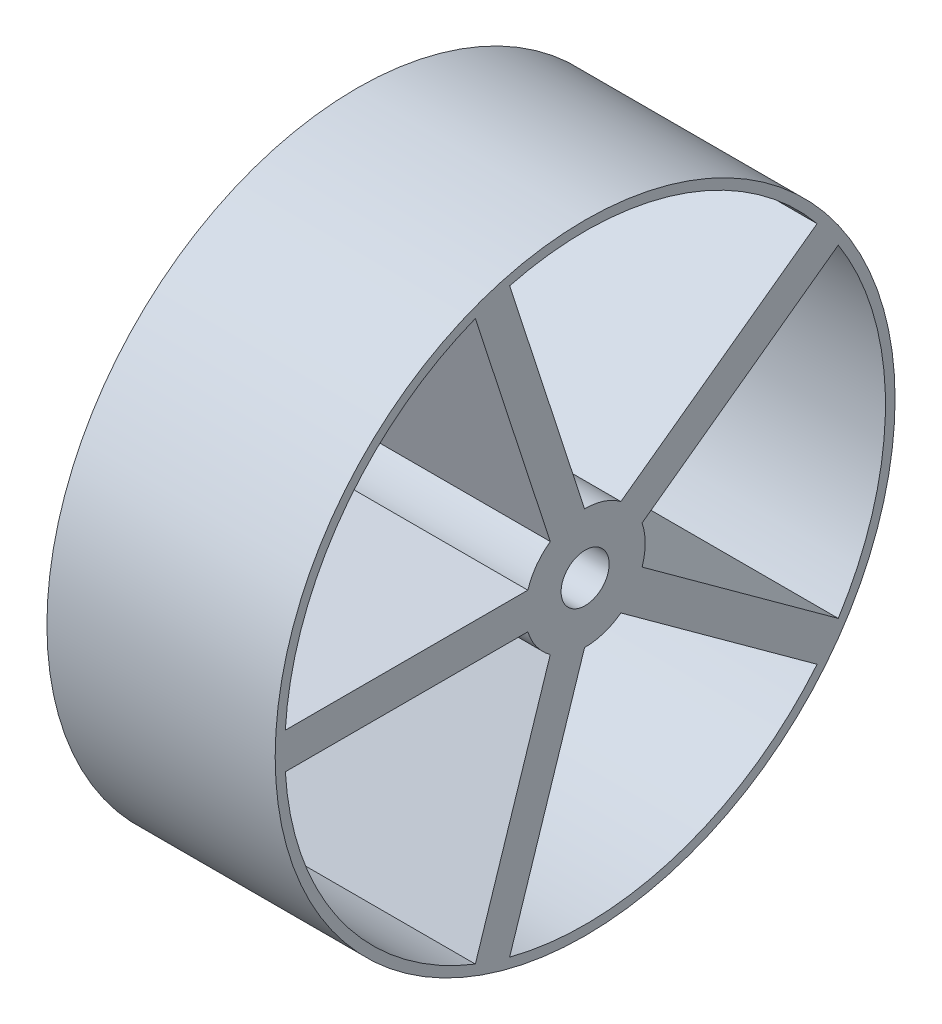
ISO-10303-21;
HEADER;
FILE_DESCRIPTION(('STEP AP214'),'2;1');
FILE_NAME('part.step','',(''),(''),'','','');
FILE_SCHEMA(('AUTOMOTIVE_DESIGN { 1 0 10303 214 1 1 1 1 }'));
ENDSEC;
DATA;
#1=APPLICATION_CONTEXT('core data for automotive mechanical design processes');
#2=APPLICATION_PROTOCOL_DEFINITION('international standard','automotive_design',2000,#1);
#3=PRODUCT_CONTEXT('',#1,'mechanical');
#4=PRODUCT('Part','Part','',(#3));
#5=PRODUCT_RELATED_PRODUCT_CATEGORY('part','',(#4));
#6=PRODUCT_DEFINITION_FORMATION('','',#4);
#7=PRODUCT_DEFINITION_CONTEXT('part definition',#1,'design');
#8=PRODUCT_DEFINITION('design','',#6,#7);
#9=PRODUCT_DEFINITION_SHAPE('','',#8);
#10=(LENGTH_UNIT() NAMED_UNIT(*) SI_UNIT(.MILLI.,.METRE.));
#11=(NAMED_UNIT(*) PLANE_ANGLE_UNIT() SI_UNIT($,.RADIAN.));
#12=(NAMED_UNIT(*) SI_UNIT($,.STERADIAN.) SOLID_ANGLE_UNIT());
#13=UNCERTAINTY_MEASURE_WITH_UNIT(LENGTH_MEASURE(1.E-05),#10,'distance_accuracy_value','');
#14=(GEOMETRIC_REPRESENTATION_CONTEXT(3) GLOBAL_UNCERTAINTY_ASSIGNED_CONTEXT((#13)) GLOBAL_UNIT_ASSIGNED_CONTEXT((#10,
#11,#12)) REPRESENTATION_CONTEXT('',''));
#15=CARTESIAN_POINT('',(0.,0.,0.));
#16=DIRECTION('',(0.,0.,1.));
#17=DIRECTION('',(1.,0.,0.));
#18=AXIS2_PLACEMENT_3D('',#15,#16,#17);
#19=CARTESIAN_POINT('',(47.5,0.,0.));
#20=DIRECTION('',(-1.,0.,0.));
#21=DIRECTION('',(0.,0.,1.));
#22=AXIS2_PLACEMENT_3D('',#19,#20,#21);
#23=CYLINDRICAL_SURFACE('',#22,25.);
#24=CARTESIAN_POINT('',(-47.5,0.,0.));
#25=DIRECTION('',(1.,0.,0.));
#26=DIRECTION('',(0.,0.,-1.));
#27=AXIS2_PLACEMENT_3D('',#24,#25,#26);
#28=CIRCLE('',#27,25.);
#29=CARTESIAN_POINT('',(-47.5,-24.9988797992366,0.236661748743184));
#30=VERTEX_POINT('',#29);
#31=CARTESIAN_POINT('',(-47.5,-20.0854123122249,-14.8854362464768));
#32=VERTEX_POINT('',#31);
#33=EDGE_CURVE('E241',#30,#32,#28,.T.);
#34=ORIENTED_EDGE('',*,*,#33,.T.);
#35=DIRECTION('',(-1.,0.,0.));
#36=VECTOR('',#35,1.);
#37=CARTESIAN_POINT('',(47.5,-20.0854123122249,-14.8854362464768));
#38=LINE('',#37,#36);
#39=CARTESIAN_POINT('',(47.5,-20.0854123122249,-14.8854362464768));
#40=VERTEX_POINT('',#39);
#41=EDGE_CURVE('E11',#40,#32,#38,.T.);
#42=ORIENTED_EDGE('',*,*,#41,.F.);
#43=CARTESIAN_POINT('',(47.5,0.,0.));
#44=DIRECTION('',(1.,0.,0.));
#45=DIRECTION('',(0.,0.,-1.));
#46=AXIS2_PLACEMENT_3D('',#43,#44,#45);
#47=CIRCLE('',#46,25.);
#48=CARTESIAN_POINT('',(47.5,-24.9988797992366,0.236661748743184));
#49=VERTEX_POINT('',#48);
#50=EDGE_CURVE('E204',#49,#40,#47,.T.);
#51=ORIENTED_EDGE('',*,*,#50,.F.);
#52=DIRECTION('',(-1.,0.,0.));
#53=VECTOR('',#52,1.);
#54=CARTESIAN_POINT('',(47.5,-24.9988797992366,0.236661748743184));
#55=LINE('',#54,#53);
#56=EDGE_CURVE('E71',#49,#30,#55,.T.);
#57=ORIENTED_EDGE('',*,*,#56,.T.);
#58=EDGE_LOOP('',(#34,#42,#51,#57));
#59=FACE_BOUND('',#58,.T.);
#60=ADVANCED_FACE('F51',(#59),#23,.T.);
#61=CARTESIAN_POINT('',(47.5,-6.06762745781136,4.40838939219295));
#62=DIRECTION('',(0.,0.809016994374951,-0.587785252292468));
#63=DIRECTION('',(0.,0.587785252292468,0.809016994374951));
#64=AXIS2_PLACEMENT_3D('',#61,#62,#63);
#65=PLANE('',#64);
#66=DIRECTION('',(0.,-0.587785252292468,-0.809016994374951));
#67=VECTOR('',#66,1.);
#68=CARTESIAN_POINT('',(-47.5,-6.06762745781136,4.40838939219295));
#69=LINE('',#68,#67);
#70=CARTESIAN_POINT('',(-47.5,-79.4084130713593,-96.5365419594483));
#71=VERTEX_POINT('',#70);
#72=EDGE_CURVE('E211',#32,#71,#69,.T.);
#73=ORIENTED_EDGE('',*,*,#72,.T.);
#74=DIRECTION('',(-1.,0.,0.));
#75=VECTOR('',#74,1.);
#76=CARTESIAN_POINT('',(47.5,-79.4084130713593,-96.5365419594483));
#77=LINE('',#76,#75);
#78=CARTESIAN_POINT('',(47.5,-79.4084130713593,-96.5365419594483));
#79=VERTEX_POINT('',#78);
#80=EDGE_CURVE('E62',#79,#71,#77,.T.);
#81=ORIENTED_EDGE('',*,*,#80,.F.);
#82=DIRECTION('',(0.,-0.587785252292468,-0.809016994374951));
#83=VECTOR('',#82,1.);
#84=CARTESIAN_POINT('',(47.5,-6.06762745781136,4.40838939219295));
#85=LINE('',#84,#83);
#86=EDGE_CURVE('E197',#40,#79,#85,.T.);
#87=ORIENTED_EDGE('',*,*,#86,.F.);
#88=ORIENTED_EDGE('',*,*,#41,.T.);
#89=EDGE_LOOP('',(#73,#81,#87,#88));
#90=FACE_BOUND('',#89,.T.);
#91=ADVANCED_FACE('F210',(#90),#65,.F.);
#92=CARTESIAN_POINT('',(47.5,0.,0.));
#93=DIRECTION('',(-1.,0.,0.));
#94=DIRECTION('',(0.,0.,1.));
#95=AXIS2_PLACEMENT_3D('',#92,#93,#94);
#96=CYLINDRICAL_SURFACE('',#95,125.);
#97=CARTESIAN_POINT('',(-47.5,0.,0.));
#98=DIRECTION('',(1.,0.,0.));
#99=DIRECTION('',(0.,0.,-1.));
#100=AXIS2_PLACEMENT_3D('',#97,#98,#99);
#101=CIRCLE('',#100,125.);
#102=CARTESIAN_POINT('',(-47.5,-120.985511342153,31.4246089120876));
#103=VERTEX_POINT('',#102);
#104=EDGE_CURVE('E290',#103,#71,#101,.T.);
#105=ORIENTED_EDGE('',*,*,#104,.F.);
#106=DIRECTION('',(-1.,0.,0.));
#107=VECTOR('',#106,1.);
#108=CARTESIAN_POINT('',(47.5,-120.985511342153,31.4246089120876));
#109=LINE('',#108,#107);
#110=CARTESIAN_POINT('',(47.5,-120.985511342153,31.4246089120876));
#111=VERTEX_POINT('',#110);
#112=EDGE_CURVE('E133',#111,#103,#109,.T.);
#113=ORIENTED_EDGE('',*,*,#112,.F.);
#114=CARTESIAN_POINT('',(47.5,0.,0.));
#115=DIRECTION('',(1.,0.,0.));
#116=DIRECTION('',(0.,0.,-1.));
#117=AXIS2_PLACEMENT_3D('',#114,#115,#116);
#118=CIRCLE('',#117,125.);
#119=EDGE_CURVE('E203',#111,#79,#118,.T.);
#120=ORIENTED_EDGE('',*,*,#119,.T.);
#121=ORIENTED_EDGE('',*,*,#80,.T.);
#122=EDGE_LOOP('',(#105,#113,#120,#121));
#123=FACE_BOUND('',#122,.T.);
#124=ADVANCED_FACE('F216',(#123),#96,.F.);
#125=CARTESIAN_POINT('',(47.5,6.06762745781291,-4.40838939219407));
#126=DIRECTION('',(0.,0.809016994374951,-0.587785252292468));
#127=DIRECTION('',(0.,0.587785252292468,0.809016994374951));
#128=AXIS2_PLACEMENT_3D('',#125,#126,#127);
#129=PLANE('',#128);
#130=DIRECTION('',(0.,-0.587785252292468,-0.809016994374951));
#131=VECTOR('',#130,1.);
#132=CARTESIAN_POINT('',(-47.5,6.06762745781291,-4.40838939219407));
#133=LINE('',#132,#131);
#134=CARTESIAN_POINT('',(-47.5,-7.95015739660028,-23.7022150308633));
#135=VERTEX_POINT('',#134);
#136=CARTESIAN_POINT('',(-47.5,-67.2731581557352,-105.353320743835));
#137=VERTEX_POINT('',#136);
#138=EDGE_CURVE('E275',#135,#137,#133,.T.);
#139=ORIENTED_EDGE('',*,*,#138,.F.);
#140=DIRECTION('',(-1.,0.,0.));
#141=VECTOR('',#140,1.);
#142=CARTESIAN_POINT('',(47.5,-7.95015739660028,-23.7022150308633));
#143=LINE('',#142,#141);
#144=CARTESIAN_POINT('',(47.5,-7.95015739660028,-23.7022150308633));
#145=VERTEX_POINT('',#144);
#146=EDGE_CURVE('E308',#145,#135,#143,.T.);
#147=ORIENTED_EDGE('',*,*,#146,.F.);
#148=DIRECTION('',(0.,-0.587785252292468,-0.809016994374951));
#149=VECTOR('',#148,1.);
#150=CARTESIAN_POINT('',(47.5,6.06762745781291,-4.40838939219407));
#151=LINE('',#150,#149);
#152=CARTESIAN_POINT('',(47.5,-67.2731581557352,-105.353320743835));
#153=VERTEX_POINT('',#152);
#154=EDGE_CURVE('E753',#145,#153,#151,.T.);
#155=ORIENTED_EDGE('',*,*,#154,.T.);
#156=DIRECTION('',(-1.,0.,0.));
#157=VECTOR('',#156,1.);
#158=CARTESIAN_POINT('',(47.5,-67.2731581557352,-105.353320743835));
#159=LINE('',#158,#157);
#160=EDGE_CURVE('E311',#153,#137,#159,.T.);
#161=ORIENTED_EDGE('',*,*,#160,.T.);
#162=EDGE_LOOP('',(#139,#147,#155,#161));
#163=FACE_BOUND('',#162,.T.);
#164=ADVANCED_FACE('F398',(#163),#129,.T.);
#165=CARTESIAN_POINT('',(-47.5,7.95015739660207,-23.7022150308627));
#166=VERTEX_POINT('',#165);
#167=EDGE_CURVE('E279',#135,#166,#28,.T.);
#168=ORIENTED_EDGE('',*,*,#167,.T.);
#169=DIRECTION('',(-1.,0.,0.));
#170=VECTOR('',#169,1.);
#171=CARTESIAN_POINT('',(47.5,7.95015739660207,-23.7022150308627));
#172=LINE('',#171,#170);
#173=CARTESIAN_POINT('',(47.5,7.95015739660207,-23.7022150308627));
#174=VERTEX_POINT('',#173);
#175=EDGE_CURVE('E318',#174,#166,#172,.T.);
#176=ORIENTED_EDGE('',*,*,#175,.F.);
#177=EDGE_CURVE('E758',#145,#174,#47,.T.);
#178=ORIENTED_EDGE('',*,*,#177,.F.);
#179=ORIENTED_EDGE('',*,*,#146,.T.);
#180=EDGE_LOOP('',(#168,#176,#178,#179));
#181=FACE_BOUND('',#180,.T.);
#182=ADVANCED_FACE('F390',(#181),#23,.T.);
#183=CARTESIAN_POINT('',(47.5,-6.06762745781152,-4.40838939219311));
#184=DIRECTION('',(0.,0.809016994374948,0.587785252292472));
#185=DIRECTION('',(0.,-0.587785252292472,0.809016994374948));
#186=AXIS2_PLACEMENT_3D('',#183,#184,#185);
#187=PLANE('',#186);
#188=DIRECTION('',(0.,0.587785252292472,-0.809016994374949));
#189=VECTOR('',#188,1.);
#190=CARTESIAN_POINT('',(-47.5,-6.06762745781152,-4.40838939219311));
#191=LINE('',#190,#189);
#192=CARTESIAN_POINT('',(-47.5,67.2731581557372,-105.353320743834));
#193=VERTEX_POINT('',#192);
#194=EDGE_CURVE('E280',#166,#193,#191,.T.);
#195=ORIENTED_EDGE('',*,*,#194,.T.);
#196=DIRECTION('',(-1.,0.,0.));
#197=VECTOR('',#196,1.);
#198=CARTESIAN_POINT('',(47.5,67.2731581557372,-105.353320743834));
#199=LINE('',#198,#197);
#200=CARTESIAN_POINT('',(47.5,67.2731581557372,-105.353320743834));
#201=VERTEX_POINT('',#200);
#202=EDGE_CURVE('E314',#201,#193,#199,.T.);
#203=ORIENTED_EDGE('',*,*,#202,.F.);
#204=DIRECTION('',(0.,0.587785252292472,-0.809016994374949));
#205=VECTOR('',#204,1.);
#206=CARTESIAN_POINT('',(47.5,-6.06762745781152,-4.40838939219311));
#207=LINE('',#206,#205);
#208=EDGE_CURVE('E762',#174,#201,#207,.T.);
#209=ORIENTED_EDGE('',*,*,#208,.F.);
#210=ORIENTED_EDGE('',*,*,#175,.T.);
#211=EDGE_LOOP('',(#195,#203,#209,#210));
#212=FACE_BOUND('',#211,.T.);
#213=ADVANCED_FACE('F397',(#212),#187,.F.);
#214=CARTESIAN_POINT('',(47.5,6.06762745781271,4.40838939219397));
#215=DIRECTION('',(0.,0.809016994374948,0.587785252292472));
#216=DIRECTION('',(0.,-0.587785252292472,0.809016994374948));
#217=AXIS2_PLACEMENT_3D('',#214,#215,#216);
#218=PLANE('',#217);
#219=DIRECTION('',(0.,0.587785252292472,-0.809016994374949));
#220=VECTOR('',#219,1.);
#221=CARTESIAN_POINT('',(-47.5,6.06762745781271,4.40838939219397));
#222=LINE('',#221,#220);
#223=CARTESIAN_POINT('',(-47.5,20.085412312226,-14.8854362464752));
#224=VERTEX_POINT('',#223);
#225=CARTESIAN_POINT('',(-47.5,79.4084130713616,-96.5365419594474));
#226=VERTEX_POINT('',#225);
#227=EDGE_CURVE('E262',#224,#226,#222,.T.);
#228=ORIENTED_EDGE('',*,*,#227,.F.);
#229=DIRECTION('',(-1.,0.,0.));
#230=VECTOR('',#229,1.);
#231=CARTESIAN_POINT('',(47.5,20.085412312226,-14.8854362464752));
#232=LINE('',#231,#230);
#233=CARTESIAN_POINT('',(47.5,20.085412312226,-14.8854362464752));
#234=VERTEX_POINT('',#233);
#235=EDGE_CURVE('E315',#234,#224,#232,.T.);
#236=ORIENTED_EDGE('',*,*,#235,.F.);
#237=DIRECTION('',(0.,0.587785252292472,-0.809016994374949));
#238=VECTOR('',#237,1.);
#239=CARTESIAN_POINT('',(47.5,6.06762745781271,4.40838939219397));
#240=LINE('',#239,#238);
#241=CARTESIAN_POINT('',(47.5,79.4084130713616,-96.5365419594474));
#242=VERTEX_POINT('',#241);
#243=EDGE_CURVE('E741',#234,#242,#240,.T.);
#244=ORIENTED_EDGE('',*,*,#243,.T.);
#245=DIRECTION('',(-1.,0.,0.));
#246=VECTOR('',#245,1.);
#247=CARTESIAN_POINT('',(47.5,79.4084130713616,-96.5365419594474));
#248=LINE('',#247,#246);
#249=EDGE_CURVE('E324',#242,#226,#248,.T.);
#250=ORIENTED_EDGE('',*,*,#249,.T.);
#251=EDGE_LOOP('',(#228,#236,#244,#250));
#252=FACE_BOUND('',#251,.T.);
#253=ADVANCED_FACE('F404',(#252),#218,.T.);
#254=CARTESIAN_POINT('',(-47.5,24.9988797992366,0.236661748743887));
#255=VERTEX_POINT('',#254);
#256=EDGE_CURVE('E266',#224,#255,#28,.T.);
#257=ORIENTED_EDGE('',*,*,#256,.T.);
#258=DIRECTION('',(-1.,0.,0.));
#259=VECTOR('',#258,1.);
#260=CARTESIAN_POINT('',(47.5,24.9988797992366,0.236661748743887));
#261=LINE('',#260,#259);
#262=CARTESIAN_POINT('',(47.5,24.9988797992366,0.236661748743887));
#263=VERTEX_POINT('',#262);
#264=EDGE_CURVE('E331',#263,#255,#261,.T.);
#265=ORIENTED_EDGE('',*,*,#264,.F.);
#266=EDGE_CURVE('E746',#234,#263,#47,.T.);
#267=ORIENTED_EDGE('',*,*,#266,.F.);
#268=ORIENTED_EDGE('',*,*,#235,.T.);
#269=EDGE_LOOP('',(#257,#265,#267,#268));
#270=FACE_BOUND('',#269,.T.);
#271=ADVANCED_FACE('F400',(#270),#23,.T.);
#272=CARTESIAN_POINT('',(47.5,2.31762745781204,-7.13292387221357));
#273=DIRECTION('',(0.,-0.309016994374943,0.951056516295155));
#274=DIRECTION('',(0.,-0.951056516295155,-0.309016994374943));
#275=AXIS2_PLACEMENT_3D('',#272,#273,#274);
#276=PLANE('',#275);
#277=DIRECTION('',(0.,0.951056516295155,0.309016994374943));
#278=VECTOR('',#277,1.);
#279=CARTESIAN_POINT('',(-47.5,2.31762745781204,-7.13292387221357));
#280=LINE('',#279,#278);
#281=CARTESIAN_POINT('',(-47.5,120.985511342154,31.424608912088));
#282=VERTEX_POINT('',#281);
#283=EDGE_CURVE('E267',#255,#282,#280,.T.);
#284=ORIENTED_EDGE('',*,*,#283,.T.);
#285=DIRECTION('',(-1.,0.,0.));
#286=VECTOR('',#285,1.);
#287=CARTESIAN_POINT('',(47.5,120.985511342154,31.424608912088));
#288=LINE('',#287,#286);
#289=CARTESIAN_POINT('',(47.5,120.985511342154,31.424608912088));
#290=VERTEX_POINT('',#289);
#291=EDGE_CURVE('E327',#290,#282,#288,.T.);
#292=ORIENTED_EDGE('',*,*,#291,.F.);
#293=DIRECTION('',(0.,0.951056516295155,0.309016994374943));
#294=VECTOR('',#293,1.);
#295=CARTESIAN_POINT('',(47.5,2.31762745781204,-7.13292387221357));
#296=LINE('',#295,#294);
#297=EDGE_CURVE('E751',#263,#290,#296,.T.);
#298=ORIENTED_EDGE('',*,*,#297,.F.);
#299=ORIENTED_EDGE('',*,*,#264,.T.);
#300=EDGE_LOOP('',(#284,#292,#298,#299));
#301=FACE_BOUND('',#300,.T.);
#302=ADVANCED_FACE('F411',(#301),#276,.F.);
#303=CARTESIAN_POINT('',(47.5,-2.31762745781211,7.13292387221376));
#304=DIRECTION('',(0.,-0.309016994374943,0.951056516295155));
#305=DIRECTION('',(0.,-0.951056516295155,-0.309016994374943));
#306=AXIS2_PLACEMENT_3D('',#303,#304,#305);
#307=PLANE('',#306);
#308=DIRECTION('',(0.,0.951056516295155,0.309016994374943));
#309=VECTOR('',#308,1.);
#310=CARTESIAN_POINT('',(-47.5,-2.31762745781211,7.13292387221376));
#311=LINE('',#310,#309);
#312=CARTESIAN_POINT('',(-47.5,20.3636248836124,14.5025094931712));
#313=VERTEX_POINT('',#312);
#314=CARTESIAN_POINT('',(-47.5,116.350256426529,45.6904566565152));
#315=VERTEX_POINT('',#314);
#316=EDGE_CURVE('E250',#313,#315,#311,.T.);
#317=ORIENTED_EDGE('',*,*,#316,.F.);
#318=DIRECTION('',(-1.,0.,0.));
#319=VECTOR('',#318,1.);
#320=CARTESIAN_POINT('',(47.5,20.3636248836124,14.5025094931712));
#321=LINE('',#320,#319);
#322=CARTESIAN_POINT('',(47.5,20.3636248836124,14.5025094931712));
#323=VERTEX_POINT('',#322);
#324=EDGE_CURVE('E328',#323,#313,#321,.T.);
#325=ORIENTED_EDGE('',*,*,#324,.F.);
#326=DIRECTION('',(0.,0.951056516295155,0.309016994374943));
#327=VECTOR('',#326,1.);
#328=CARTESIAN_POINT('',(47.5,-2.31762745781211,7.13292387221376));
#329=LINE('',#328,#327);
#330=CARTESIAN_POINT('',(47.5,116.350256426529,45.6904566565152));
#331=VERTEX_POINT('',#330);
#332=EDGE_CURVE('E782',#323,#331,#329,.T.);
#333=ORIENTED_EDGE('',*,*,#332,.T.);
#334=DIRECTION('',(-1.,0.,0.));
#335=VECTOR('',#334,1.);
#336=CARTESIAN_POINT('',(47.5,116.350256426529,45.6904566565152));
#337=LINE('',#336,#335);
#338=EDGE_CURVE('E337',#331,#315,#337,.T.);
#339=ORIENTED_EDGE('',*,*,#338,.T.);
#340=EDGE_LOOP('',(#317,#325,#333,#339));
#341=FACE_BOUND('',#340,.T.);
#342=ADVANCED_FACE('F416',(#341),#307,.T.);
#343=CARTESIAN_POINT('',(-47.5,7.5,23.8484800354236));
#344=VERTEX_POINT('',#343);
#345=EDGE_CURVE('E242',#313,#344,#28,.T.);
#346=ORIENTED_EDGE('',*,*,#345,.T.);
#347=DIRECTION('',(-1.,0.,0.));
#348=VECTOR('',#347,1.);
#349=CARTESIAN_POINT('',(47.5,7.5,23.8484800354236));
#350=LINE('',#349,#348);
#351=CARTESIAN_POINT('',(47.5,7.5,23.8484800354236));
#352=VERTEX_POINT('',#351);
#353=EDGE_CURVE('E343',#352,#344,#350,.T.);
#354=ORIENTED_EDGE('',*,*,#353,.F.);
#355=EDGE_CURVE('E776',#323,#352,#47,.T.);
#356=ORIENTED_EDGE('',*,*,#355,.F.);
#357=ORIENTED_EDGE('',*,*,#324,.T.);
#358=EDGE_LOOP('',(#346,#354,#356,#357));
#359=FACE_BOUND('',#358,.T.);
#360=ADVANCED_FACE('F387',(#359),#23,.T.);
#361=CARTESIAN_POINT('',(47.5,7.5,0.));
#362=DIRECTION('',(0.,-1.,0.));
#363=DIRECTION('',(0.,0.,-1.));
#364=AXIS2_PLACEMENT_3D('',#361,#362,#363);
#365=PLANE('',#364);
#366=DIRECTION('',(0.,0.,1.));
#367=VECTOR('',#366,1.);
#368=CARTESIAN_POINT('',(-47.5,7.5,0.));
#369=LINE('',#368,#367);
#370=CARTESIAN_POINT('',(-47.5,7.5,124.774797134678));
#371=VERTEX_POINT('',#370);
#372=EDGE_CURVE('E254',#344,#371,#369,.T.);
#373=ORIENTED_EDGE('',*,*,#372,.T.);
#374=DIRECTION('',(-1.,0.,0.));
#375=VECTOR('',#374,1.);
#376=CARTESIAN_POINT('',(47.5,7.5,124.774797134678));
#377=LINE('',#376,#375);
#378=CARTESIAN_POINT('',(47.5,7.5,124.774797134678));
#379=VERTEX_POINT('',#378);
#380=EDGE_CURVE('E340',#379,#371,#377,.T.);
#381=ORIENTED_EDGE('',*,*,#380,.F.);
#382=DIRECTION('',(0.,0.,1.));
#383=VECTOR('',#382,1.);
#384=CARTESIAN_POINT('',(47.5,7.5,0.));
#385=LINE('',#384,#383);
#386=EDGE_CURVE('E781',#352,#379,#385,.T.);
#387=ORIENTED_EDGE('',*,*,#386,.F.);
#388=ORIENTED_EDGE('',*,*,#353,.T.);
#389=EDGE_LOOP('',(#373,#381,#387,#388));
#390=FACE_BOUND('',#389,.T.);
#391=ADVANCED_FACE('F423',(#390),#365,.F.);
#392=CARTESIAN_POINT('',(47.5,-7.5,0.));
#393=DIRECTION('',(0.,-1.,0.));
#394=DIRECTION('',(0.,0.,-1.));
#395=AXIS2_PLACEMENT_3D('',#392,#393,#394);
#396=PLANE('',#395);
#397=DIRECTION('',(0.,0.,1.));
#398=VECTOR('',#397,1.);
#399=CARTESIAN_POINT('',(-47.5,-7.5,0.));
#400=LINE('',#399,#398);
#401=CARTESIAN_POINT('',(-47.5,-7.5,23.8484800354236));
#402=VERTEX_POINT('',#401);
#403=CARTESIAN_POINT('',(-47.5,-7.5,124.774797134678));
#404=VERTEX_POINT('',#403);
#405=EDGE_CURVE('E233',#402,#404,#400,.T.);
#406=ORIENTED_EDGE('',*,*,#405,.F.);
#407=DIRECTION('',(-1.,0.,0.));
#408=VECTOR('',#407,1.);
#409=CARTESIAN_POINT('',(47.5,-7.5,23.8484800354236));
#410=LINE('',#409,#408);
#411=CARTESIAN_POINT('',(47.5,-7.5,23.8484800354236));
#412=VERTEX_POINT('',#411);
#413=EDGE_CURVE('E55',#412,#402,#410,.T.);
#414=ORIENTED_EDGE('',*,*,#413,.F.);
#415=DIRECTION('',(0.,0.,1.));
#416=VECTOR('',#415,1.);
#417=CARTESIAN_POINT('',(47.5,-7.5,0.));
#418=LINE('',#417,#416);
#419=CARTESIAN_POINT('',(47.5,-7.5,124.774797134678));
#420=VERTEX_POINT('',#419);
#421=EDGE_CURVE('E305',#412,#420,#418,.T.);
#422=ORIENTED_EDGE('',*,*,#421,.T.);
#423=DIRECTION('',(-1.,0.,0.));
#424=VECTOR('',#423,1.);
#425=CARTESIAN_POINT('',(47.5,-7.5,124.774797134678));
#426=LINE('',#425,#424);
#427=EDGE_CURVE('E232',#420,#404,#426,.T.);
#428=ORIENTED_EDGE('',*,*,#427,.T.);
#429=EDGE_LOOP('',(#406,#414,#422,#428));
#430=FACE_BOUND('',#429,.T.);
#431=ADVANCED_FACE('F53',(#430),#396,.T.);
#432=CARTESIAN_POINT('',(-47.5,-20.3636248836128,14.5025094931706));
#433=VERTEX_POINT('',#432);
#434=EDGE_CURVE('E237',#402,#433,#28,.T.);
#435=ORIENTED_EDGE('',*,*,#434,.T.);
#436=DIRECTION('',(-1.,0.,0.));
#437=VECTOR('',#436,1.);
#438=CARTESIAN_POINT('',(47.5,-20.3636248836128,14.5025094931706));
#439=LINE('',#438,#437);
#440=CARTESIAN_POINT('',(47.5,-20.3636248836128,14.5025094931706));
#441=VERTEX_POINT('',#440);
#442=EDGE_CURVE('E353',#441,#433,#439,.T.);
#443=ORIENTED_EDGE('',*,*,#442,.F.);
#444=EDGE_CURVE('E364',#412,#441,#47,.T.);
#445=ORIENTED_EDGE('',*,*,#444,.F.);
#446=ORIENTED_EDGE('',*,*,#413,.T.);
#447=EDGE_LOOP('',(#435,#443,#445,#446));
#448=FACE_BOUND('',#447,.T.);
#449=ADVANCED_FACE('F363',(#448),#23,.T.);
#450=CARTESIAN_POINT('',(47.5,2.3176274578119,7.13292387221301));
#451=DIRECTION('',(0.,-0.309016994374947,-0.951056516295154));
#452=DIRECTION('',(0.,0.951056516295154,-0.309016994374947));
#453=AXIS2_PLACEMENT_3D('',#450,#451,#452);
#454=PLANE('',#453);
#455=DIRECTION('',(0.,-0.951056516295154,0.309016994374947));
#456=VECTOR('',#455,1.);
#457=CARTESIAN_POINT('',(-47.5,2.3176274578119,7.13292387221301));
#458=LINE('',#457,#456);
#459=CARTESIAN_POINT('',(-47.5,-116.350256426529,45.6904566565149));
#460=VERTEX_POINT('',#459);
#461=EDGE_CURVE('E240',#433,#460,#458,.T.);
#462=ORIENTED_EDGE('',*,*,#461,.T.);
#463=DIRECTION('',(-1.,0.,0.));
#464=VECTOR('',#463,1.);
#465=CARTESIAN_POINT('',(47.5,-116.350256426529,45.6904566565149));
#466=LINE('',#465,#464);
#467=CARTESIAN_POINT('',(47.5,-116.350256426529,45.6904566565149));
#468=VERTEX_POINT('',#467);
#469=EDGE_CURVE('E351',#468,#460,#466,.T.);
#470=ORIENTED_EDGE('',*,*,#469,.F.);
#471=DIRECTION('',(0.,-0.951056516295154,0.309016994374947));
#472=VECTOR('',#471,1.);
#473=CARTESIAN_POINT('',(47.5,2.3176274578119,7.13292387221301));
#474=LINE('',#473,#472);
#475=EDGE_CURVE('E775',#441,#468,#474,.T.);
#476=ORIENTED_EDGE('',*,*,#475,.F.);
#477=ORIENTED_EDGE('',*,*,#442,.T.);
#478=EDGE_LOOP('',(#462,#470,#476,#477));
#479=FACE_BOUND('',#478,.T.);
#480=ADVANCED_FACE('F376',(#479),#454,.F.);
#481=CARTESIAN_POINT('',(47.5,0.,0.));
#482=DIRECTION('',(-1.,0.,0.));
#483=DIRECTION('',(0.,0.,1.));
#484=AXIS2_PLACEMENT_3D('',#481,#482,#483);
#485=CYLINDRICAL_SURFACE('',#484,129.);
#486=CARTESIAN_POINT('',(47.5,0.,0.));
#487=DIRECTION('',(1.,0.,0.));
#488=DIRECTION('',(0.,0.,-1.));
#489=AXIS2_PLACEMENT_3D('',#486,#487,#488);
#490=CIRCLE('',#489,129.);
#491=CARTESIAN_POINT('',(47.5,0.,-129.));
#492=VERTEX_POINT('',#491);
#493=EDGE_CURVE('E221',#492,#492,#490,.T.);
#494=ORIENTED_EDGE('',*,*,#493,.F.);
#495=EDGE_LOOP('',(#494));
#496=FACE_BOUND('',#495,.T.);
#497=CARTESIAN_POINT('',(-47.5,0.,0.));
#498=DIRECTION('',(1.,0.,0.));
#499=DIRECTION('',(0.,0.,-1.));
#500=AXIS2_PLACEMENT_3D('',#497,#498,#499);
#501=CIRCLE('',#500,129.);
#502=CARTESIAN_POINT('',(-47.5,0.,-129.));
#503=VERTEX_POINT('',#502);
#504=EDGE_CURVE('E297',#503,#503,#501,.T.);
#505=ORIENTED_EDGE('',*,*,#504,.T.);
#506=EDGE_LOOP('',(#505));
#507=FACE_BOUND('',#506,.T.);
#508=ADVANCED_FACE('F378',(#496,#507),#485,.T.);
#509=CARTESIAN_POINT('',(47.5,-2.31762745781232,-7.13292387221431));
#510=DIRECTION('',(0.,-0.309016994374948,-0.951056516295153));
#511=DIRECTION('',(0.,0.951056516295154,-0.309016994374948));
#512=AXIS2_PLACEMENT_3D('',#509,#510,#511);
#513=PLANE('',#512);
#514=DIRECTION('',(0.,-0.951056516295154,0.309016994374948));
#515=VECTOR('',#514,1.);
#516=CARTESIAN_POINT('',(-47.5,-2.31762745781232,-7.13292387221431));
#517=LINE('',#516,#515);
#518=EDGE_CURVE('E293',#30,#103,#517,.T.);
#519=ORIENTED_EDGE('',*,*,#518,.F.);
#520=ORIENTED_EDGE('',*,*,#56,.F.);
#521=DIRECTION('',(0.,-0.951056516295154,0.309016994374948));
#522=VECTOR('',#521,1.);
#523=CARTESIAN_POINT('',(47.5,-2.31762745781232,-7.13292387221431));
#524=LINE('',#523,#522);
#525=EDGE_CURVE('E218',#49,#111,#524,.T.);
#526=ORIENTED_EDGE('',*,*,#525,.T.);
#527=ORIENTED_EDGE('',*,*,#112,.T.);
#528=EDGE_LOOP('',(#519,#520,#526,#527));
#529=FACE_BOUND('',#528,.T.);
#530=ADVANCED_FACE('F383',(#529),#513,.T.);
#531=CARTESIAN_POINT('',(47.5,0.,0.));
#532=DIRECTION('',(-1.,0.,0.));
#533=DIRECTION('',(0.,0.,1.));
#534=AXIS2_PLACEMENT_3D('',#531,#532,#533);
#535=CYLINDRICAL_SURFACE('',#534,125.);
#536=CARTESIAN_POINT('',(-47.5,0.,0.));
#537=DIRECTION('',(1.,0.,0.));
#538=DIRECTION('',(0.,0.,-1.));
#539=AXIS2_PLACEMENT_3D('',#536,#537,#538);
#540=CIRCLE('',#539,125.);
#541=EDGE_CURVE('E284',#137,#193,#540,.T.);
#542=ORIENTED_EDGE('',*,*,#541,.F.);
#543=ORIENTED_EDGE('',*,*,#160,.F.);
#544=CARTESIAN_POINT('',(47.5,0.,0.));
#545=DIRECTION('',(1.,0.,0.));
#546=DIRECTION('',(0.,0.,-1.));
#547=AXIS2_PLACEMENT_3D('',#544,#545,#546);
#548=CIRCLE('',#547,125.);
#549=EDGE_CURVE('E764',#153,#201,#548,.T.);
#550=ORIENTED_EDGE('',*,*,#549,.T.);
#551=ORIENTED_EDGE('',*,*,#202,.T.);
#552=EDGE_LOOP('',(#542,#543,#550,#551));
#553=FACE_BOUND('',#552,.T.);
#554=ADVANCED_FACE('F448',(#553),#535,.F.);
#555=CARTESIAN_POINT('',(47.5,0.,0.));
#556=DIRECTION('',(-1.,0.,0.));
#557=DIRECTION('',(0.,0.,1.));
#558=AXIS2_PLACEMENT_3D('',#555,#556,#557);
#559=CYLINDRICAL_SURFACE('',#558,125.);
#560=CARTESIAN_POINT('',(-47.5,0.,0.));
#561=DIRECTION('',(1.,0.,0.));
#562=DIRECTION('',(0.,0.,-1.));
#563=AXIS2_PLACEMENT_3D('',#560,#561,#562);
#564=CIRCLE('',#563,125.);
#565=EDGE_CURVE('E271',#226,#282,#564,.T.);
#566=ORIENTED_EDGE('',*,*,#565,.F.);
#567=ORIENTED_EDGE('',*,*,#249,.F.);
#568=CARTESIAN_POINT('',(47.5,0.,0.));
#569=DIRECTION('',(1.,0.,0.));
#570=DIRECTION('',(0.,0.,-1.));
#571=AXIS2_PLACEMENT_3D('',#568,#569,#570);
#572=CIRCLE('',#571,125.);
#573=EDGE_CURVE('E749',#242,#290,#572,.T.);
#574=ORIENTED_EDGE('',*,*,#573,.T.);
#575=ORIENTED_EDGE('',*,*,#291,.T.);
#576=EDGE_LOOP('',(#566,#567,#574,#575));
#577=FACE_BOUND('',#576,.T.);
#578=ADVANCED_FACE('F453',(#577),#559,.F.);
#579=CARTESIAN_POINT('',(47.5,0.,0.));
#580=DIRECTION('',(-1.,0.,0.));
#581=DIRECTION('',(0.,0.,1.));
#582=AXIS2_PLACEMENT_3D('',#579,#580,#581);
#583=CYLINDRICAL_SURFACE('',#582,125.);
#584=CARTESIAN_POINT('',(-47.5,0.,0.));
#585=DIRECTION('',(1.,0.,0.));
#586=DIRECTION('',(0.,0.,-1.));
#587=AXIS2_PLACEMENT_3D('',#584,#585,#586);
#588=CIRCLE('',#587,125.);
#589=EDGE_CURVE('E258',#315,#371,#588,.T.);
#590=ORIENTED_EDGE('',*,*,#589,.F.);
#591=ORIENTED_EDGE('',*,*,#338,.F.);
#592=CARTESIAN_POINT('',(47.5,0.,0.));
#593=DIRECTION('',(1.,0.,0.));
#594=DIRECTION('',(0.,0.,-1.));
#595=AXIS2_PLACEMENT_3D('',#592,#593,#594);
#596=CIRCLE('',#595,125.);
#597=EDGE_CURVE('E747',#331,#379,#596,.T.);
#598=ORIENTED_EDGE('',*,*,#597,.T.);
#599=ORIENTED_EDGE('',*,*,#380,.T.);
#600=EDGE_LOOP('',(#590,#591,#598,#599));
#601=FACE_BOUND('',#600,.T.);
#602=ADVANCED_FACE('F509',(#601),#583,.F.);
#603=CARTESIAN_POINT('',(47.5,0.,0.));
#604=DIRECTION('',(-1.,0.,0.));
#605=DIRECTION('',(0.,0.,1.));
#606=AXIS2_PLACEMENT_3D('',#603,#604,#605);
#607=CYLINDRICAL_SURFACE('',#606,125.);
#608=CARTESIAN_POINT('',(-47.5,0.,0.));
#609=DIRECTION('',(1.,0.,0.));
#610=DIRECTION('',(0.,0.,-1.));
#611=AXIS2_PLACEMENT_3D('',#608,#609,#610);
#612=CIRCLE('',#611,125.);
#613=EDGE_CURVE('E246',#404,#460,#612,.T.);
#614=ORIENTED_EDGE('',*,*,#613,.F.);
#615=ORIENTED_EDGE('',*,*,#427,.F.);
#616=CARTESIAN_POINT('',(47.5,0.,0.));
#617=DIRECTION('',(1.,0.,0.));
#618=DIRECTION('',(0.,0.,-1.));
#619=AXIS2_PLACEMENT_3D('',#616,#617,#618);
#620=CIRCLE('',#619,125.);
#621=EDGE_CURVE('E374',#420,#468,#620,.T.);
#622=ORIENTED_EDGE('',*,*,#621,.T.);
#623=ORIENTED_EDGE('',*,*,#469,.T.);
#624=EDGE_LOOP('',(#614,#615,#622,#623));
#625=FACE_BOUND('',#624,.T.);
#626=ADVANCED_FACE('F373',(#625),#607,.F.);
#627=CARTESIAN_POINT('',(47.5,0.,0.));
#628=DIRECTION('',(-1.,0.,0.));
#629=DIRECTION('',(0.,0.,1.));
#630=AXIS2_PLACEMENT_3D('',#627,#628,#629);
#631=CYLINDRICAL_SURFACE('',#630,10.);
#632=CARTESIAN_POINT('',(47.5,0.,0.));
#633=DIRECTION('',(1.,0.,0.));
#634=DIRECTION('',(0.,0.,-1.));
#635=AXIS2_PLACEMENT_3D('',#632,#633,#634);
#636=CIRCLE('',#635,10.);
#637=CARTESIAN_POINT('',(47.5,0.,-10.));
#638=VERTEX_POINT('',#637);
#639=EDGE_CURVE('E228',#638,#638,#636,.T.);
#640=ORIENTED_EDGE('',*,*,#639,.T.);
#641=EDGE_LOOP('',(#640));
#642=FACE_BOUND('',#641,.T.);
#643=CARTESIAN_POINT('',(-47.5,0.,0.));
#644=DIRECTION('',(1.,0.,0.));
#645=DIRECTION('',(0.,0.,-1.));
#646=AXIS2_PLACEMENT_3D('',#643,#644,#645);
#647=CIRCLE('',#646,10.);
#648=CARTESIAN_POINT('',(-47.5,0.,-10.));
#649=VERTEX_POINT('',#648);
#650=EDGE_CURVE('E301',#649,#649,#647,.T.);
#651=ORIENTED_EDGE('',*,*,#650,.F.);
#652=EDGE_LOOP('',(#651));
#653=FACE_BOUND('',#652,.T.);
#654=ADVANCED_FACE('F486',(#642,#653),#631,.F.);
#655=CARTESIAN_POINT('',(47.5,0.,0.));
#656=DIRECTION('',(1.,0.,0.));
#657=DIRECTION('',(0.,0.,-1.));
#658=AXIS2_PLACEMENT_3D('',#655,#656,#657);
#659=PLANE('',#658);
#660=ORIENTED_EDGE('',*,*,#421,.F.);
#661=ORIENTED_EDGE('',*,*,#444,.T.);
#662=ORIENTED_EDGE('',*,*,#475,.T.);
#663=ORIENTED_EDGE('',*,*,#621,.F.);
#664=EDGE_LOOP('',(#660,#661,#662,#663));
#665=FACE_BOUND('',#664,.T.);
#666=ORIENTED_EDGE('',*,*,#332,.F.);
#667=ORIENTED_EDGE('',*,*,#355,.T.);
#668=ORIENTED_EDGE('',*,*,#386,.T.);
#669=ORIENTED_EDGE('',*,*,#597,.F.);
#670=EDGE_LOOP('',(#666,#667,#668,#669));
#671=FACE_BOUND('',#670,.T.);
#672=ORIENTED_EDGE('',*,*,#243,.F.);
#673=ORIENTED_EDGE('',*,*,#266,.T.);
#674=ORIENTED_EDGE('',*,*,#297,.T.);
#675=ORIENTED_EDGE('',*,*,#573,.F.);
#676=EDGE_LOOP('',(#672,#673,#674,#675));
#677=FACE_BOUND('',#676,.T.);
#678=ORIENTED_EDGE('',*,*,#154,.F.);
#679=ORIENTED_EDGE('',*,*,#177,.T.);
#680=ORIENTED_EDGE('',*,*,#208,.T.);
#681=ORIENTED_EDGE('',*,*,#549,.F.);
#682=EDGE_LOOP('',(#678,#679,#680,#681));
#683=FACE_BOUND('',#682,.T.);
#684=ORIENTED_EDGE('',*,*,#50,.T.);
#685=ORIENTED_EDGE('',*,*,#86,.T.);
#686=ORIENTED_EDGE('',*,*,#119,.F.);
#687=ORIENTED_EDGE('',*,*,#525,.F.);
#688=EDGE_LOOP('',(#684,#685,#686,#687));
#689=FACE_BOUND('',#688,.T.);
#690=ORIENTED_EDGE('',*,*,#493,.T.);
#691=EDGE_LOOP('',(#690));
#692=FACE_BOUND('',#691,.T.);
#693=ORIENTED_EDGE('',*,*,#639,.F.);
#694=EDGE_LOOP('',(#693));
#695=FACE_BOUND('',#694,.T.);
#696=ADVANCED_FACE('F199',(#665,#671,#677,#683,#689,#692,#695),#659,.T.);
#697=CARTESIAN_POINT('',(-47.5,0.,0.));
#698=DIRECTION('',(1.,0.,0.));
#699=DIRECTION('',(0.,0.,-1.));
#700=AXIS2_PLACEMENT_3D('',#697,#698,#699);
#701=PLANE('',#700);
#702=ORIENTED_EDGE('',*,*,#405,.T.);
#703=ORIENTED_EDGE('',*,*,#613,.T.);
#704=ORIENTED_EDGE('',*,*,#461,.F.);
#705=ORIENTED_EDGE('',*,*,#434,.F.);
#706=EDGE_LOOP('',(#702,#703,#704,#705));
#707=FACE_BOUND('',#706,.T.);
#708=ORIENTED_EDGE('',*,*,#316,.T.);
#709=ORIENTED_EDGE('',*,*,#589,.T.);
#710=ORIENTED_EDGE('',*,*,#372,.F.);
#711=ORIENTED_EDGE('',*,*,#345,.F.);
#712=EDGE_LOOP('',(#708,#709,#710,#711));
#713=FACE_BOUND('',#712,.T.);
#714=ORIENTED_EDGE('',*,*,#227,.T.);
#715=ORIENTED_EDGE('',*,*,#565,.T.);
#716=ORIENTED_EDGE('',*,*,#283,.F.);
#717=ORIENTED_EDGE('',*,*,#256,.F.);
#718=EDGE_LOOP('',(#714,#715,#716,#717));
#719=FACE_BOUND('',#718,.T.);
#720=ORIENTED_EDGE('',*,*,#138,.T.);
#721=ORIENTED_EDGE('',*,*,#541,.T.);
#722=ORIENTED_EDGE('',*,*,#194,.F.);
#723=ORIENTED_EDGE('',*,*,#167,.F.);
#724=EDGE_LOOP('',(#720,#721,#722,#723));
#725=FACE_BOUND('',#724,.T.);
#726=ORIENTED_EDGE('',*,*,#33,.F.);
#727=ORIENTED_EDGE('',*,*,#518,.T.);
#728=ORIENTED_EDGE('',*,*,#104,.T.);
#729=ORIENTED_EDGE('',*,*,#72,.F.);
#730=EDGE_LOOP('',(#726,#727,#728,#729));
#731=FACE_BOUND('',#730,.T.);
#732=ORIENTED_EDGE('',*,*,#504,.F.);
#733=EDGE_LOOP('',(#732));
#734=FACE_BOUND('',#733,.T.);
#735=ORIENTED_EDGE('',*,*,#650,.T.);
#736=EDGE_LOOP('',(#735));
#737=FACE_BOUND('',#736,.T.);
#738=ADVANCED_FACE('F367',(#707,#713,#719,#725,#731,#734,#737),#701,.F.);
#739=CLOSED_SHELL('',(#60,#91,#124,#164,#182,#213,#253,#271,#302,#342,#360,#391,#431,#449,#480,
#508,#530,#554,#578,#602,#626,#654,#696,#738));
#740=MANIFOLD_SOLID_BREP('B2',#739);
#741=ADVANCED_BREP_SHAPE_REPRESENTATION('',(#18,#740),#14);
#742=SHAPE_DEFINITION_REPRESENTATION(#9,#741);
ENDSEC;
END-ISO-10303-21;
